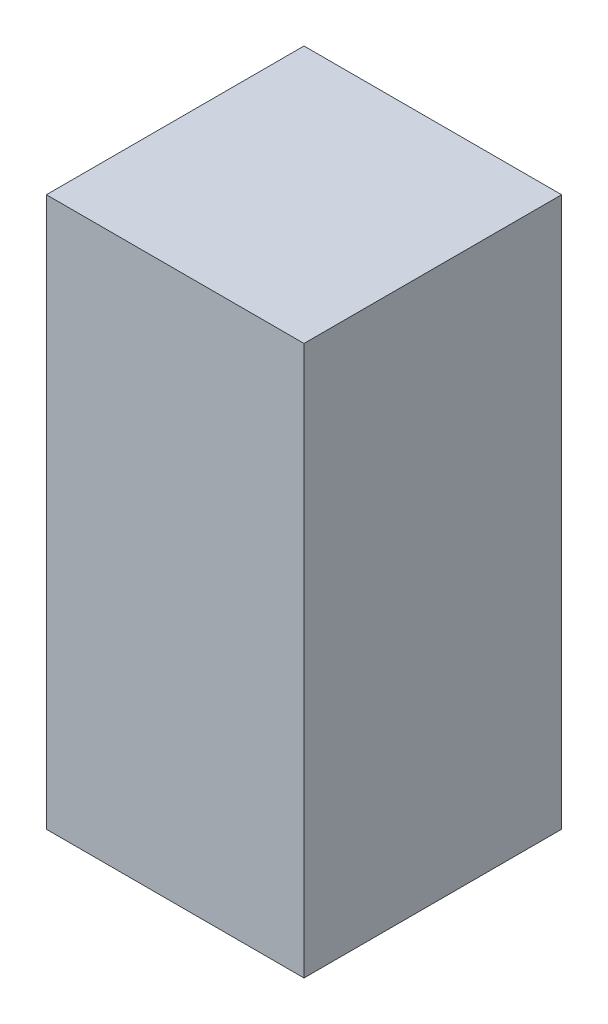
ISO-10303-21;
HEADER;
FILE_DESCRIPTION(('STEP AP214'),'2;1');
FILE_NAME('part.step','',(''),(''),'','','');
FILE_SCHEMA(('AUTOMOTIVE_DESIGN { 1 0 10303 214 1 1 1 1 }'));
ENDSEC;
DATA;
#1=APPLICATION_CONTEXT('core data for automotive mechanical design processes');
#2=APPLICATION_PROTOCOL_DEFINITION('international standard','automotive_design',2000,#1);
#3=PRODUCT_CONTEXT('',#1,'mechanical');
#4=PRODUCT('Part','Part','',(#3));
#5=PRODUCT_RELATED_PRODUCT_CATEGORY('part','',(#4));
#6=PRODUCT_DEFINITION_FORMATION('','',#4);
#7=PRODUCT_DEFINITION_CONTEXT('part definition',#1,'design');
#8=PRODUCT_DEFINITION('design','',#6,#7);
#9=PRODUCT_DEFINITION_SHAPE('','',#8);
#10=(LENGTH_UNIT() NAMED_UNIT(*) SI_UNIT(.MILLI.,.METRE.));
#11=(NAMED_UNIT(*) PLANE_ANGLE_UNIT() SI_UNIT($,.RADIAN.));
#12=(NAMED_UNIT(*) SI_UNIT($,.STERADIAN.) SOLID_ANGLE_UNIT());
#13=UNCERTAINTY_MEASURE_WITH_UNIT(LENGTH_MEASURE(1.E-05),#10,'distance_accuracy_value','');
#14=(GEOMETRIC_REPRESENTATION_CONTEXT(3) GLOBAL_UNCERTAINTY_ASSIGNED_CONTEXT((#13)) GLOBAL_UNIT_ASSIGNED_CONTEXT((#10,
#11,#12)) REPRESENTATION_CONTEXT('',''));
#15=CARTESIAN_POINT('',(0.,0.,0.));
#16=DIRECTION('',(0.,0.,1.));
#17=DIRECTION('',(1.,0.,0.));
#18=AXIS2_PLACEMENT_3D('',#15,#16,#17);
#19=CARTESIAN_POINT('',(-0.75,1.6,1.5));
#20=DIRECTION('',(1.,0.,0.));
#21=DIRECTION('',(0.,1.,0.));
#22=AXIS2_PLACEMENT_3D('',#19,#20,#21);
#23=PLANE('',#22);
#24=DIRECTION('',(0.,0.,1.));
#25=VECTOR('',#24,1.);
#26=CARTESIAN_POINT('',(-0.75,-1.6,1.5));
#27=LINE('',#26,#25);
#28=CARTESIAN_POINT('',(-0.75,-1.6,0.));
#29=VERTEX_POINT('',#28);
#30=CARTESIAN_POINT('',(-0.75,-1.6,1.5));
#31=VERTEX_POINT('',#30);
#32=EDGE_CURVE('E20',#29,#31,#27,.T.);
#33=ORIENTED_EDGE('',*,*,#32,.T.);
#34=DIRECTION('',(0.,1.,0.));
#35=VECTOR('',#34,1.);
#36=CARTESIAN_POINT('',(-0.75,0.,1.5));
#37=LINE('',#36,#35);
#38=CARTESIAN_POINT('',(-0.75,1.6,1.5));
#39=VERTEX_POINT('',#38);
#40=EDGE_CURVE('E55',#39,#31,#37,.F.);
#41=ORIENTED_EDGE('',*,*,#40,.F.);
#42=DIRECTION('',(0.,0.,-1.));
#43=VECTOR('',#42,1.);
#44=CARTESIAN_POINT('',(-0.75,1.6,1.5));
#45=LINE('',#44,#43);
#46=CARTESIAN_POINT('',(-0.75,1.6,0.));
#47=VERTEX_POINT('',#46);
#48=EDGE_CURVE('E74',#39,#47,#45,.T.);
#49=ORIENTED_EDGE('',*,*,#48,.T.);
#50=DIRECTION('',(0.,1.,0.));
#51=VECTOR('',#50,1.);
#52=CARTESIAN_POINT('',(-0.75,0.,0.));
#53=LINE('',#52,#51);
#54=EDGE_CURVE('E66',#47,#29,#53,.F.);
#55=ORIENTED_EDGE('',*,*,#54,.T.);
#56=EDGE_LOOP('',(#33,#41,#49,#55));
#57=FACE_BOUND('',#56,.T.);
#58=ADVANCED_FACE('F17',(#57),#23,.F.);
#59=CARTESIAN_POINT('',(-0.75,-1.6,1.5));
#60=DIRECTION('',(0.,1.,0.));
#61=DIRECTION('',(0.,0.,1.));
#62=AXIS2_PLACEMENT_3D('',#59,#60,#61);
#63=PLANE('',#62);
#64=DIRECTION('',(0.,0.,1.));
#65=VECTOR('',#64,1.);
#66=CARTESIAN_POINT('',(0.75,-1.6,1.5));
#67=LINE('',#66,#65);
#68=CARTESIAN_POINT('',(0.75,-1.6,0.));
#69=VERTEX_POINT('',#68);
#70=CARTESIAN_POINT('',(0.75,-1.6,1.5));
#71=VERTEX_POINT('',#70);
#72=EDGE_CURVE('E72',#69,#71,#67,.T.);
#73=ORIENTED_EDGE('',*,*,#72,.T.);
#74=DIRECTION('',(1.,0.,0.));
#75=VECTOR('',#74,1.);
#76=CARTESIAN_POINT('',(0.,-1.6,1.5));
#77=LINE('',#76,#75);
#78=EDGE_CURVE('E62',#31,#71,#77,.T.);
#79=ORIENTED_EDGE('',*,*,#78,.F.);
#80=ORIENTED_EDGE('',*,*,#32,.F.);
#81=DIRECTION('',(1.,0.,0.));
#82=VECTOR('',#81,1.);
#83=CARTESIAN_POINT('',(0.,-1.6,0.));
#84=LINE('',#83,#82);
#85=EDGE_CURVE('E80',#29,#69,#84,.T.);
#86=ORIENTED_EDGE('',*,*,#85,.T.);
#87=EDGE_LOOP('',(#73,#79,#80,#86));
#88=FACE_BOUND('',#87,.T.);
#89=ADVANCED_FACE('F71',(#88),#63,.F.);
#90=CARTESIAN_POINT('',(0.,0.,1.5));
#91=DIRECTION('',(0.,0.,1.));
#92=DIRECTION('',(1.,0.,0.));
#93=AXIS2_PLACEMENT_3D('',#90,#91,#92);
#94=PLANE('',#93);
#95=ORIENTED_EDGE('',*,*,#40,.T.);
#96=ORIENTED_EDGE('',*,*,#78,.T.);
#97=DIRECTION('',(0.,-1.,0.));
#98=VECTOR('',#97,1.);
#99=CARTESIAN_POINT('',(0.75,1.6,1.5));
#100=LINE('',#99,#98);
#101=CARTESIAN_POINT('',(0.75,1.6,1.5));
#102=VERTEX_POINT('',#101);
#103=EDGE_CURVE('E83',#71,#102,#100,.F.);
#104=ORIENTED_EDGE('',*,*,#103,.T.);
#105=DIRECTION('',(1.,0.,0.));
#106=VECTOR('',#105,1.);
#107=CARTESIAN_POINT('',(-0.75,1.6,1.5));
#108=LINE('',#107,#106);
#109=EDGE_CURVE('E64',#102,#39,#108,.F.);
#110=ORIENTED_EDGE('',*,*,#109,.T.);
#111=EDGE_LOOP('',(#95,#96,#104,#110));
#112=FACE_BOUND('',#111,.T.);
#113=ADVANCED_FACE('F59',(#112),#94,.T.);
#114=CARTESIAN_POINT('',(-0.75,1.6,1.5));
#115=DIRECTION('',(0.,-1.,0.));
#116=DIRECTION('',(0.,0.,-1.));
#117=AXIS2_PLACEMENT_3D('',#114,#115,#116);
#118=PLANE('',#117);
#119=ORIENTED_EDGE('',*,*,#48,.F.);
#120=ORIENTED_EDGE('',*,*,#109,.F.);
#121=DIRECTION('',(0.,0.,1.));
#122=VECTOR('',#121,1.);
#123=CARTESIAN_POINT('',(0.75,1.6,1.5));
#124=LINE('',#123,#122);
#125=CARTESIAN_POINT('',(0.75,1.6,0.));
#126=VERTEX_POINT('',#125);
#127=EDGE_CURVE('E26',#102,#126,#124,.F.);
#128=ORIENTED_EDGE('',*,*,#127,.T.);
#129=DIRECTION('',(1.,0.,0.));
#130=VECTOR('',#129,1.);
#131=CARTESIAN_POINT('',(0.,1.6,0.));
#132=LINE('',#131,#130);
#133=EDGE_CURVE('E34',#126,#47,#132,.F.);
#134=ORIENTED_EDGE('',*,*,#133,.T.);
#135=EDGE_LOOP('',(#119,#120,#128,#134));
#136=FACE_BOUND('',#135,.T.);
#137=ADVANCED_FACE('F88',(#136),#118,.F.);
#138=CARTESIAN_POINT('',(0.,0.,0.));
#139=DIRECTION('',(0.,0.,1.));
#140=DIRECTION('',(1.,0.,0.));
#141=AXIS2_PLACEMENT_3D('',#138,#139,#140);
#142=PLANE('',#141);
#143=ORIENTED_EDGE('',*,*,#85,.F.);
#144=ORIENTED_EDGE('',*,*,#54,.F.);
#145=ORIENTED_EDGE('',*,*,#133,.F.);
#146=DIRECTION('',(0.,-1.,0.));
#147=VECTOR('',#146,1.);
#148=CARTESIAN_POINT('',(0.75,1.6,0.));
#149=LINE('',#148,#147);
#150=EDGE_CURVE('E11',#126,#69,#149,.T.);
#151=ORIENTED_EDGE('',*,*,#150,.T.);
#152=EDGE_LOOP('',(#143,#144,#145,#151));
#153=FACE_BOUND('',#152,.T.);
#154=ADVANCED_FACE('F91',(#153),#142,.F.);
#155=CARTESIAN_POINT('',(0.75,1.6,1.5));
#156=DIRECTION('',(-1.,0.,0.));
#157=DIRECTION('',(0.,-1.,0.));
#158=AXIS2_PLACEMENT_3D('',#155,#156,#157);
#159=PLANE('',#158);
#160=ORIENTED_EDGE('',*,*,#127,.F.);
#161=ORIENTED_EDGE('',*,*,#103,.F.);
#162=ORIENTED_EDGE('',*,*,#72,.F.);
#163=ORIENTED_EDGE('',*,*,#150,.F.);
#164=EDGE_LOOP('',(#160,#161,#162,#163));
#165=FACE_BOUND('',#164,.T.);
#166=ADVANCED_FACE('F90',(#165),#159,.F.);
#167=CLOSED_SHELL('',(#58,#89,#113,#137,#154,#166));
#168=MANIFOLD_SOLID_BREP('B1',#167);
#169=ADVANCED_BREP_SHAPE_REPRESENTATION('',(#18,#168),#14);
#170=SHAPE_DEFINITION_REPRESENTATION(#9,#169);
ENDSEC;
END-ISO-10303-21;
